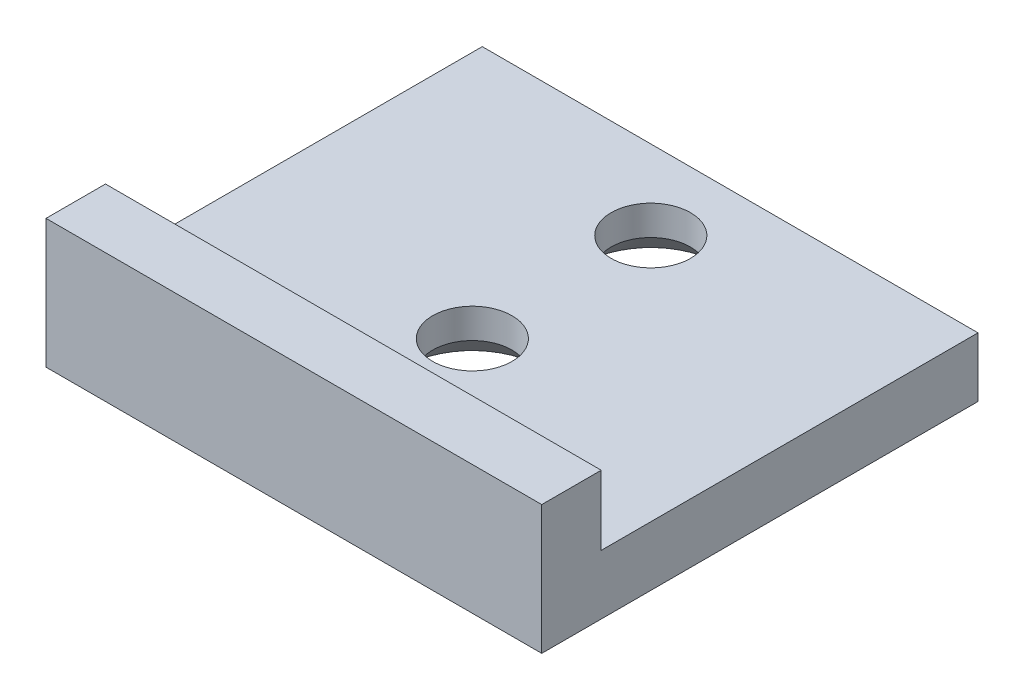
ISO-10303-21;
HEADER;
FILE_DESCRIPTION(('STEP AP214'),'2;1');
FILE_NAME('part.step','',(''),(''),'','','');
FILE_SCHEMA(('AUTOMOTIVE_DESIGN { 1 0 10303 214 1 1 1 1 }'));
ENDSEC;
DATA;
#1=APPLICATION_CONTEXT('core data for automotive mechanical design processes');
#2=APPLICATION_PROTOCOL_DEFINITION('international standard','automotive_design',2000,#1);
#3=PRODUCT_CONTEXT('',#1,'mechanical');
#4=PRODUCT('Part','Part','',(#3));
#5=PRODUCT_RELATED_PRODUCT_CATEGORY('part','',(#4));
#6=PRODUCT_DEFINITION_FORMATION('','',#4);
#7=PRODUCT_DEFINITION_CONTEXT('part definition',#1,'design');
#8=PRODUCT_DEFINITION('design','',#6,#7);
#9=PRODUCT_DEFINITION_SHAPE('','',#8);
#10=(LENGTH_UNIT() NAMED_UNIT(*) SI_UNIT(.MILLI.,.METRE.));
#11=(NAMED_UNIT(*) PLANE_ANGLE_UNIT() SI_UNIT($,.RADIAN.));
#12=(NAMED_UNIT(*) SI_UNIT($,.STERADIAN.) SOLID_ANGLE_UNIT());
#13=UNCERTAINTY_MEASURE_WITH_UNIT(LENGTH_MEASURE(1.E-05),#10,'distance_accuracy_value','');
#14=(GEOMETRIC_REPRESENTATION_CONTEXT(3) GLOBAL_UNCERTAINTY_ASSIGNED_CONTEXT((#13)) GLOBAL_UNIT_ASSIGNED_CONTEXT((#10,
#11,#12)) REPRESENTATION_CONTEXT('',''));
#15=CARTESIAN_POINT('',(0.,0.,0.));
#16=DIRECTION('',(0.,0.,1.));
#17=DIRECTION('',(1.,0.,0.));
#18=AXIS2_PLACEMENT_3D('',#15,#16,#17);
#19=CARTESIAN_POINT('',(25.,6.5,22.));
#20=DIRECTION('',(-1.,0.,0.));
#21=DIRECTION('',(0.,0.,1.));
#22=AXIS2_PLACEMENT_3D('',#19,#20,#21);
#23=PLANE('',#22);
#24=DIRECTION('',(0.,-1.,0.));
#25=VECTOR('',#24,1.);
#26=CARTESIAN_POINT('',(25.,6.5,-22.));
#27=LINE('',#26,#25);
#28=CARTESIAN_POINT('',(25.,-0.5,-22.));
#29=VERTEX_POINT('',#28);
#30=CARTESIAN_POINT('',(25.,-6.5,-22.));
#31=VERTEX_POINT('',#30);
#32=EDGE_CURVE('E136',#29,#31,#27,.T.);
#33=ORIENTED_EDGE('',*,*,#32,.F.);
#34=DIRECTION('',(0.,0.,-1.));
#35=VECTOR('',#34,1.);
#36=CARTESIAN_POINT('',(25.,-0.5,16.));
#37=LINE('',#36,#35);
#38=CARTESIAN_POINT('',(25.,-0.5,16.));
#39=VERTEX_POINT('',#38);
#40=EDGE_CURVE('E174',#39,#29,#37,.T.);
#41=ORIENTED_EDGE('',*,*,#40,.F.);
#42=DIRECTION('',(0.,-1.,0.));
#43=VECTOR('',#42,1.);
#44=CARTESIAN_POINT('',(25.,6.5,16.));
#45=LINE('',#44,#43);
#46=CARTESIAN_POINT('',(25.,6.5,16.));
#47=VERTEX_POINT('',#46);
#48=EDGE_CURVE('E168',#47,#39,#45,.T.);
#49=ORIENTED_EDGE('',*,*,#48,.F.);
#50=DIRECTION('',(0.,0.,-1.));
#51=VECTOR('',#50,1.);
#52=CARTESIAN_POINT('',(25.,6.5,22.));
#53=LINE('',#52,#51);
#54=CARTESIAN_POINT('',(25.,6.5,22.));
#55=VERTEX_POINT('',#54);
#56=EDGE_CURVE('E103',#55,#47,#53,.T.);
#57=ORIENTED_EDGE('',*,*,#56,.F.);
#58=DIRECTION('',(0.,-1.,0.));
#59=VECTOR('',#58,1.);
#60=CARTESIAN_POINT('',(25.,6.5,22.));
#61=LINE('',#60,#59);
#62=CARTESIAN_POINT('',(25.,-6.5,22.));
#63=VERTEX_POINT('',#62);
#64=EDGE_CURVE('E95',#55,#63,#61,.T.);
#65=ORIENTED_EDGE('',*,*,#64,.T.);
#66=DIRECTION('',(0.,0.,-1.));
#67=VECTOR('',#66,1.);
#68=CARTESIAN_POINT('',(25.,-6.5,22.));
#69=LINE('',#68,#67);
#70=EDGE_CURVE('E109',#63,#31,#69,.T.);
#71=ORIENTED_EDGE('',*,*,#70,.T.);
#72=EDGE_LOOP('',(#33,#41,#49,#57,#65,#71));
#73=FACE_BOUND('',#72,.T.);
#74=ADVANCED_FACE('F47',(#73),#23,.F.);
#75=CARTESIAN_POINT('',(-25.,6.5,-22.));
#76=DIRECTION('',(0.,0.,1.));
#77=DIRECTION('',(1.,0.,0.));
#78=AXIS2_PLACEMENT_3D('',#75,#76,#77);
#79=PLANE('',#78);
#80=DIRECTION('',(0.,-1.,0.));
#81=VECTOR('',#80,1.);
#82=CARTESIAN_POINT('',(-25.,6.5,-22.));
#83=LINE('',#82,#81);
#84=CARTESIAN_POINT('',(-25.,-0.5,-22.));
#85=VERTEX_POINT('',#84);
#86=CARTESIAN_POINT('',(-25.,-6.5,-22.));
#87=VERTEX_POINT('',#86);
#88=EDGE_CURVE('E133',#85,#87,#83,.T.);
#89=ORIENTED_EDGE('',*,*,#88,.F.);
#90=DIRECTION('',(1.,0.,0.));
#91=VECTOR('',#90,1.);
#92=CARTESIAN_POINT('',(-25.,-0.5,-22.));
#93=LINE('',#92,#91);
#94=EDGE_CURVE('E118',#85,#29,#93,.T.);
#95=ORIENTED_EDGE('',*,*,#94,.T.);
#96=ORIENTED_EDGE('',*,*,#32,.T.);
#97=DIRECTION('',(-1.,0.,0.));
#98=VECTOR('',#97,1.);
#99=CARTESIAN_POINT('',(-25.,-6.5,-22.));
#100=LINE('',#99,#98);
#101=EDGE_CURVE('E116',#31,#87,#100,.T.);
#102=ORIENTED_EDGE('',*,*,#101,.T.);
#103=EDGE_LOOP('',(#89,#95,#96,#102));
#104=FACE_BOUND('',#103,.T.);
#105=ADVANCED_FACE('F205',(#104),#79,.F.);
#106=CARTESIAN_POINT('',(-25.,6.5,22.));
#107=DIRECTION('',(1.,0.,0.));
#108=DIRECTION('',(0.,0.,-1.));
#109=AXIS2_PLACEMENT_3D('',#106,#107,#108);
#110=PLANE('',#109);
#111=DIRECTION('',(0.,-1.,0.));
#112=VECTOR('',#111,1.);
#113=CARTESIAN_POINT('',(-25.,6.5,16.));
#114=LINE('',#113,#112);
#115=CARTESIAN_POINT('',(-25.,6.5,16.));
#116=VERTEX_POINT('',#115);
#117=CARTESIAN_POINT('',(-25.,-0.5,16.));
#118=VERTEX_POINT('',#117);
#119=EDGE_CURVE('E64',#116,#118,#114,.T.);
#120=ORIENTED_EDGE('',*,*,#119,.T.);
#121=DIRECTION('',(0.,0.,-1.));
#122=VECTOR('',#121,1.);
#123=CARTESIAN_POINT('',(-25.,-0.5,16.));
#124=LINE('',#123,#122);
#125=EDGE_CURVE('E181',#118,#85,#124,.T.);
#126=ORIENTED_EDGE('',*,*,#125,.T.);
#127=ORIENTED_EDGE('',*,*,#88,.T.);
#128=DIRECTION('',(0.,0.,1.));
#129=VECTOR('',#128,1.);
#130=CARTESIAN_POINT('',(-25.,-6.5,22.));
#131=LINE('',#130,#129);
#132=CARTESIAN_POINT('',(-25.,-6.5,22.));
#133=VERTEX_POINT('',#132);
#134=EDGE_CURVE('E104',#87,#133,#131,.T.);
#135=ORIENTED_EDGE('',*,*,#134,.T.);
#136=DIRECTION('',(0.,-1.,0.));
#137=VECTOR('',#136,1.);
#138=CARTESIAN_POINT('',(-25.,6.5,22.));
#139=LINE('',#138,#137);
#140=CARTESIAN_POINT('',(-25.,6.5,22.));
#141=VERTEX_POINT('',#140);
#142=EDGE_CURVE('E98',#141,#133,#139,.T.);
#143=ORIENTED_EDGE('',*,*,#142,.F.);
#144=DIRECTION('',(0.,0.,1.));
#145=VECTOR('',#144,1.);
#146=CARTESIAN_POINT('',(-25.,6.5,22.));
#147=LINE('',#146,#145);
#148=EDGE_CURVE('E195',#116,#141,#147,.T.);
#149=ORIENTED_EDGE('',*,*,#148,.F.);
#150=EDGE_LOOP('',(#120,#126,#127,#135,#143,#149));
#151=FACE_BOUND('',#150,.T.);
#152=ADVANCED_FACE('F201',(#151),#110,.F.);
#153=CARTESIAN_POINT('',(-25.,6.5,22.));
#154=DIRECTION('',(0.,0.,-1.));
#155=DIRECTION('',(-1.,0.,0.));
#156=AXIS2_PLACEMENT_3D('',#153,#154,#155);
#157=PLANE('',#156);
#158=DIRECTION('',(1.,0.,0.));
#159=VECTOR('',#158,1.);
#160=CARTESIAN_POINT('',(-25.,-6.5,22.));
#161=LINE('',#160,#159);
#162=EDGE_CURVE('E92',#133,#63,#161,.T.);
#163=ORIENTED_EDGE('',*,*,#162,.T.);
#164=ORIENTED_EDGE('',*,*,#64,.F.);
#165=DIRECTION('',(1.,0.,0.));
#166=VECTOR('',#165,1.);
#167=CARTESIAN_POINT('',(-25.,6.5,22.));
#168=LINE('',#167,#166);
#169=EDGE_CURVE('E73',#141,#55,#168,.T.);
#170=ORIENTED_EDGE('',*,*,#169,.F.);
#171=ORIENTED_EDGE('',*,*,#142,.T.);
#172=EDGE_LOOP('',(#163,#164,#170,#171));
#173=FACE_BOUND('',#172,.T.);
#174=ADVANCED_FACE('F94',(#173),#157,.F.);
#175=CARTESIAN_POINT('',(0.,6.5,0.));
#176=DIRECTION('',(0.,-1.,0.));
#177=DIRECTION('',(0.,0.,-1.));
#178=AXIS2_PLACEMENT_3D('',#175,#176,#177);
#179=PLANE('',#178);
#180=ORIENTED_EDGE('',*,*,#56,.T.);
#181=DIRECTION('',(1.,0.,0.));
#182=VECTOR('',#181,1.);
#183=CARTESIAN_POINT('',(-25.,6.5,16.));
#184=LINE('',#183,#182);
#185=EDGE_CURVE('E184',#116,#47,#184,.T.);
#186=ORIENTED_EDGE('',*,*,#185,.F.);
#187=ORIENTED_EDGE('',*,*,#148,.T.);
#188=ORIENTED_EDGE('',*,*,#169,.T.);
#189=EDGE_LOOP('',(#180,#186,#187,#188));
#190=FACE_BOUND('',#189,.T.);
#191=ADVANCED_FACE('F199',(#190),#179,.F.);
#192=CARTESIAN_POINT('',(0.,-6.5,0.));
#193=DIRECTION('',(0.,-1.,0.));
#194=DIRECTION('',(0.,0.,-1.));
#195=AXIS2_PLACEMENT_3D('',#192,#193,#194);
#196=PLANE('',#195);
#197=CARTESIAN_POINT('',(0.,-6.5,4.));
#198=DIRECTION('',(0.,-1.,0.));
#199=DIRECTION('',(0.,0.,-1.));
#200=AXIS2_PLACEMENT_3D('',#197,#198,#199);
#201=CIRCLE('',#200,7.00000000000001);
#202=CARTESIAN_POINT('',(0.,-6.5,-3.00000000000001));
#203=VERTEX_POINT('',#202);
#204=EDGE_CURVE('E57',#203,#203,#201,.F.);
#205=ORIENTED_EDGE('',*,*,#204,.T.);
#206=EDGE_LOOP('',(#205));
#207=FACE_BOUND('',#206,.T.);
#208=CARTESIAN_POINT('',(0.,-6.5,-14.));
#209=DIRECTION('',(0.,-1.,0.));
#210=DIRECTION('',(0.,0.,-1.));
#211=AXIS2_PLACEMENT_3D('',#208,#209,#210);
#212=CIRCLE('',#211,7.00000000000001);
#213=CARTESIAN_POINT('',(0.,-6.5,-21.));
#214=VERTEX_POINT('',#213);
#215=EDGE_CURVE('E143',#214,#214,#212,.F.);
#216=ORIENTED_EDGE('',*,*,#215,.T.);
#217=EDGE_LOOP('',(#216));
#218=FACE_BOUND('',#217,.T.);
#219=ORIENTED_EDGE('',*,*,#70,.F.);
#220=ORIENTED_EDGE('',*,*,#162,.F.);
#221=ORIENTED_EDGE('',*,*,#134,.F.);
#222=ORIENTED_EDGE('',*,*,#101,.F.);
#223=EDGE_LOOP('',(#219,#220,#221,#222));
#224=FACE_BOUND('',#223,.T.);
#225=ADVANCED_FACE('F114',(#207,#218,#224),#196,.T.);
#226=CARTESIAN_POINT('',(-25.,-0.5,16.));
#227=DIRECTION('',(0.,-1.,0.));
#228=DIRECTION('',(0.,0.,-1.));
#229=AXIS2_PLACEMENT_3D('',#226,#227,#228);
#230=PLANE('',#229);
#231=CARTESIAN_POINT('',(0.,-0.5,-14.));
#232=DIRECTION('',(0.,-1.,0.));
#233=DIRECTION('',(0.,0.,-1.));
#234=AXIS2_PLACEMENT_3D('',#231,#232,#233);
#235=CIRCLE('',#234,4.);
#236=CARTESIAN_POINT('',(0.,-0.5,-18.));
#237=VERTEX_POINT('',#236);
#238=EDGE_CURVE('E169',#237,#237,#235,.T.);
#239=ORIENTED_EDGE('',*,*,#238,.T.);
#240=EDGE_LOOP('',(#239));
#241=FACE_BOUND('',#240,.T.);
#242=CARTESIAN_POINT('',(0.,-0.5,4.));
#243=DIRECTION('',(0.,-1.,0.));
#244=DIRECTION('',(0.,0.,-1.));
#245=AXIS2_PLACEMENT_3D('',#242,#243,#244);
#246=CIRCLE('',#245,4.);
#247=CARTESIAN_POINT('',(0.,-0.5,0.));
#248=VERTEX_POINT('',#247);
#249=EDGE_CURVE('E165',#248,#248,#246,.T.);
#250=ORIENTED_EDGE('',*,*,#249,.T.);
#251=EDGE_LOOP('',(#250));
#252=FACE_BOUND('',#251,.T.);
#253=ORIENTED_EDGE('',*,*,#40,.T.);
#254=ORIENTED_EDGE('',*,*,#94,.F.);
#255=ORIENTED_EDGE('',*,*,#125,.F.);
#256=DIRECTION('',(1.,0.,0.));
#257=VECTOR('',#256,1.);
#258=CARTESIAN_POINT('',(-25.,-0.5,16.));
#259=LINE('',#258,#257);
#260=EDGE_CURVE('E124',#118,#39,#259,.T.);
#261=ORIENTED_EDGE('',*,*,#260,.T.);
#262=EDGE_LOOP('',(#253,#254,#255,#261));
#263=FACE_BOUND('',#262,.T.);
#264=ADVANCED_FACE('F217',(#241,#252,#263),#230,.F.);
#265=CARTESIAN_POINT('',(-25.,6.5,16.));
#266=DIRECTION('',(0.,0.,1.));
#267=DIRECTION('',(1.,0.,0.));
#268=AXIS2_PLACEMENT_3D('',#265,#266,#267);
#269=PLANE('',#268);
#270=ORIENTED_EDGE('',*,*,#48,.T.);
#271=ORIENTED_EDGE('',*,*,#260,.F.);
#272=ORIENTED_EDGE('',*,*,#119,.F.);
#273=ORIENTED_EDGE('',*,*,#185,.T.);
#274=EDGE_LOOP('',(#270,#271,#272,#273));
#275=FACE_BOUND('',#274,.T.);
#276=ADVANCED_FACE('F161',(#275),#269,.F.);
#277=CARTESIAN_POINT('',(0.,-6.5,4.));
#278=DIRECTION('',(0.,-1.,0.));
#279=DIRECTION('',(0.,0.,-1.));
#280=AXIS2_PLACEMENT_3D('',#277,#278,#279);
#281=CYLINDRICAL_SURFACE('',#280,4.);
#282=CARTESIAN_POINT('',(0.,-3.5,4.));
#283=DIRECTION('',(0.,-1.,0.));
#284=DIRECTION('',(0.,0.,-1.));
#285=AXIS2_PLACEMENT_3D('',#282,#283,#284);
#286=CIRCLE('',#285,4.);
#287=CARTESIAN_POINT('',(0.,-3.5,0.));
#288=VERTEX_POINT('',#287);
#289=EDGE_CURVE('E139',#288,#288,#286,.T.);
#290=ORIENTED_EDGE('',*,*,#289,.T.);
#291=EDGE_LOOP('',(#290));
#292=FACE_BOUND('',#291,.T.);
#293=ORIENTED_EDGE('',*,*,#249,.F.);
#294=EDGE_LOOP('',(#293));
#295=FACE_BOUND('',#294,.T.);
#296=ADVANCED_FACE('F158',(#292,#295),#281,.F.);
#297=CARTESIAN_POINT('',(0.,-6.5,-14.));
#298=DIRECTION('',(0.,-1.,0.));
#299=DIRECTION('',(0.,0.,-1.));
#300=AXIS2_PLACEMENT_3D('',#297,#298,#299);
#301=CYLINDRICAL_SURFACE('',#300,4.);
#302=CARTESIAN_POINT('',(0.,-3.5,-14.));
#303=DIRECTION('',(0.,-1.,0.));
#304=DIRECTION('',(0.,0.,-1.));
#305=AXIS2_PLACEMENT_3D('',#302,#303,#304);
#306=CIRCLE('',#305,4.);
#307=CARTESIAN_POINT('',(0.,-3.5,-18.));
#308=VERTEX_POINT('',#307);
#309=EDGE_CURVE('E11',#308,#308,#306,.T.);
#310=ORIENTED_EDGE('',*,*,#309,.T.);
#311=EDGE_LOOP('',(#310));
#312=FACE_BOUND('',#311,.T.);
#313=ORIENTED_EDGE('',*,*,#238,.F.);
#314=EDGE_LOOP('',(#313));
#315=FACE_BOUND('',#314,.T.);
#316=ADVANCED_FACE('F155',(#312,#315),#301,.F.);
#317=CARTESIAN_POINT('',(0.,-3.5,4.));
#318=DIRECTION('',(0.,-1.,0.));
#319=DIRECTION('',(0.,0.,-1.));
#320=AXIS2_PLACEMENT_3D('',#317,#318,#319);
#321=CONICAL_SURFACE('',#320,4.,0.78539816339745);
#322=ORIENTED_EDGE('',*,*,#204,.F.);
#323=EDGE_LOOP('',(#322));
#324=FACE_BOUND('',#323,.T.);
#325=ORIENTED_EDGE('',*,*,#289,.F.);
#326=EDGE_LOOP('',(#325));
#327=FACE_BOUND('',#326,.T.);
#328=ADVANCED_FACE('F152',(#324,#327),#321,.F.);
#329=CARTESIAN_POINT('',(0.,-3.5,-14.));
#330=DIRECTION('',(0.,-1.,0.));
#331=DIRECTION('',(0.,0.,-1.));
#332=AXIS2_PLACEMENT_3D('',#329,#330,#331);
#333=CONICAL_SURFACE('',#332,4.,0.78539816339745);
#334=ORIENTED_EDGE('',*,*,#215,.F.);
#335=EDGE_LOOP('',(#334));
#336=FACE_BOUND('',#335,.T.);
#337=ORIENTED_EDGE('',*,*,#309,.F.);
#338=EDGE_LOOP('',(#337));
#339=FACE_BOUND('',#338,.T.);
#340=ADVANCED_FACE('F50',(#336,#339),#333,.F.);
#341=CLOSED_SHELL('',(#74,#105,#152,#174,#191,#225,#264,#276,#296,#316,#328,#340));
#342=MANIFOLD_SOLID_BREP('B2',#341);
#343=ADVANCED_BREP_SHAPE_REPRESENTATION('',(#18,#342),#14);
#344=SHAPE_DEFINITION_REPRESENTATION(#9,#343);
ENDSEC;
END-ISO-10303-21;
